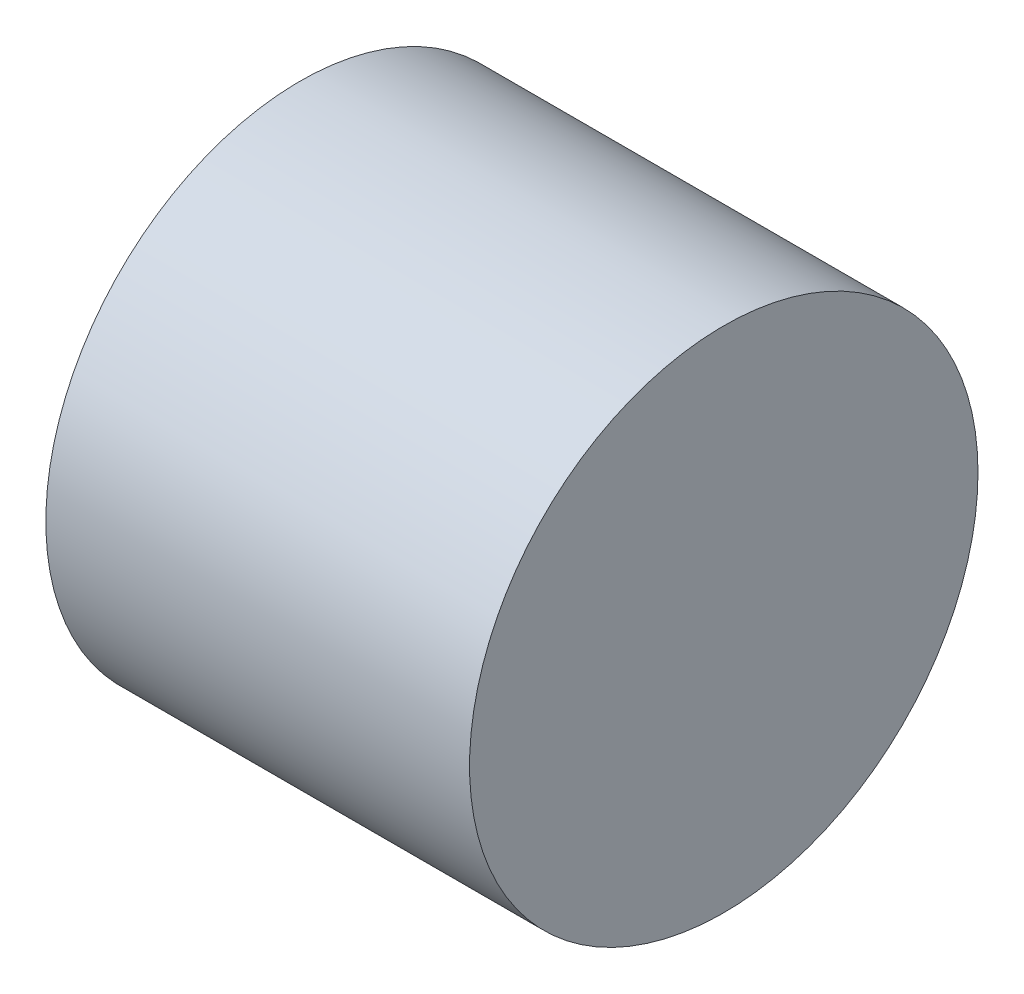
ISO-10303-21;
HEADER;
FILE_DESCRIPTION(('STEP AP214'),'2;1');
FILE_NAME('part.step','',(''),(''),'','','');
FILE_SCHEMA(('AUTOMOTIVE_DESIGN { 1 0 10303 214 1 1 1 1 }'));
ENDSEC;
DATA;
#1=APPLICATION_CONTEXT('core data for automotive mechanical design processes');
#2=APPLICATION_PROTOCOL_DEFINITION('international standard','automotive_design',2000,#1);
#3=PRODUCT_CONTEXT('',#1,'mechanical');
#4=PRODUCT('Part','Part','',(#3));
#5=PRODUCT_RELATED_PRODUCT_CATEGORY('part','',(#4));
#6=PRODUCT_DEFINITION_FORMATION('','',#4);
#7=PRODUCT_DEFINITION_CONTEXT('part definition',#1,'design');
#8=PRODUCT_DEFINITION('design','',#6,#7);
#9=PRODUCT_DEFINITION_SHAPE('','',#8);
#10=(LENGTH_UNIT() NAMED_UNIT(*) SI_UNIT(.MILLI.,.METRE.));
#11=(NAMED_UNIT(*) PLANE_ANGLE_UNIT() SI_UNIT($,.RADIAN.));
#12=(NAMED_UNIT(*) SI_UNIT($,.STERADIAN.) SOLID_ANGLE_UNIT());
#13=UNCERTAINTY_MEASURE_WITH_UNIT(LENGTH_MEASURE(1.E-05),#10,'distance_accuracy_value','');
#14=(GEOMETRIC_REPRESENTATION_CONTEXT(3) GLOBAL_UNCERTAINTY_ASSIGNED_CONTEXT((#13)) GLOBAL_UNIT_ASSIGNED_CONTEXT((#10,
#11,#12)) REPRESENTATION_CONTEXT('',''));
#15=CARTESIAN_POINT('',(0.,0.,0.));
#16=DIRECTION('',(0.,0.,1.));
#17=DIRECTION('',(1.,0.,0.));
#18=AXIS2_PLACEMENT_3D('',#15,#16,#17);
#19=CARTESIAN_POINT('',(250.,0.,0.));
#20=DIRECTION('',(-1.,0.,0.));
#21=DIRECTION('',(0.,0.,1.));
#22=AXIS2_PLACEMENT_3D('',#19,#20,#21);
#23=CYLINDRICAL_SURFACE('',#22,150.);
#24=CARTESIAN_POINT('',(250.,0.,0.));
#25=DIRECTION('',(1.,0.,0.));
#26=DIRECTION('',(0.,0.,-1.));
#27=AXIS2_PLACEMENT_3D('',#24,#25,#26);
#28=CIRCLE('',#27,150.);
#29=CARTESIAN_POINT('',(250.,0.,-150.));
#30=VERTEX_POINT('',#29);
#31=EDGE_CURVE('E10',#30,#30,#28,.T.);
#32=ORIENTED_EDGE('',*,*,#31,.F.);
#33=EDGE_LOOP('',(#32));
#34=FACE_BOUND('',#33,.T.);
#35=CARTESIAN_POINT('',(0.,0.,0.));
#36=DIRECTION('',(1.,0.,0.));
#37=DIRECTION('',(0.,0.,-1.));
#38=AXIS2_PLACEMENT_3D('',#35,#36,#37);
#39=CIRCLE('',#38,150.);
#40=CARTESIAN_POINT('',(0.,0.,-150.));
#41=VERTEX_POINT('',#40);
#42=EDGE_CURVE('E35',#41,#41,#39,.T.);
#43=ORIENTED_EDGE('',*,*,#42,.T.);
#44=EDGE_LOOP('',(#43));
#45=FACE_BOUND('',#44,.T.);
#46=ADVANCED_FACE('F32',(#34,#45),#23,.T.);
#47=CARTESIAN_POINT('',(250.,0.,0.));
#48=DIRECTION('',(1.,0.,0.));
#49=DIRECTION('',(0.,0.,-1.));
#50=AXIS2_PLACEMENT_3D('',#47,#48,#49);
#51=PLANE('',#50);
#52=ORIENTED_EDGE('',*,*,#31,.T.);
#53=EDGE_LOOP('',(#52));
#54=FACE_BOUND('',#53,.T.);
#55=ADVANCED_FACE('F47',(#54),#51,.T.);
#56=CARTESIAN_POINT('',(0.,0.,0.));
#57=DIRECTION('',(1.,0.,0.));
#58=DIRECTION('',(0.,0.,-1.));
#59=AXIS2_PLACEMENT_3D('',#56,#57,#58);
#60=PLANE('',#59);
#61=ORIENTED_EDGE('',*,*,#42,.F.);
#62=EDGE_LOOP('',(#61));
#63=FACE_BOUND('',#62,.T.);
#64=ADVANCED_FACE('F45',(#63),#60,.F.);
#65=CLOSED_SHELL('',(#46,#55,#64));
#66=MANIFOLD_SOLID_BREP('B2',#65);
#67=ADVANCED_BREP_SHAPE_REPRESENTATION('',(#18,#66),#14);
#68=SHAPE_DEFINITION_REPRESENTATION(#9,#67);
ENDSEC;
END-ISO-10303-21;
